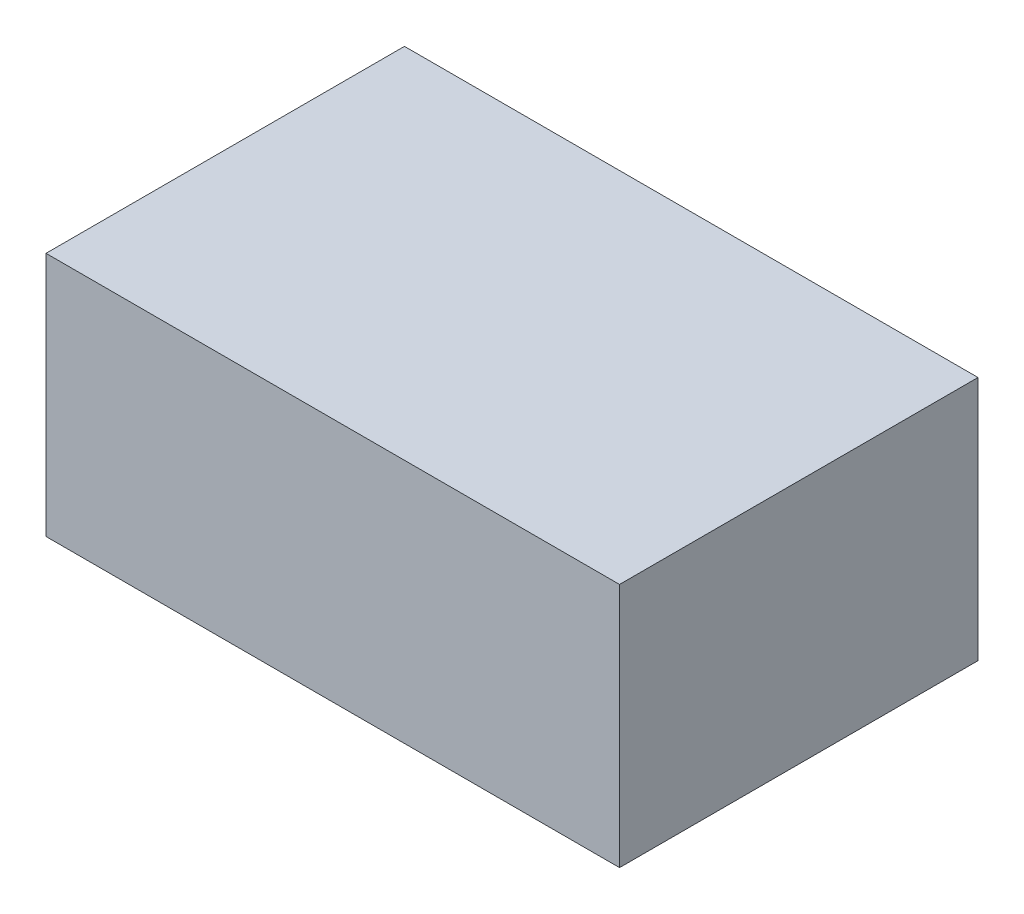
ISO-10303-21;
HEADER;
FILE_DESCRIPTION(('STEP AP214'),'2;1');
FILE_NAME('part.step','',(''),(''),'','','');
FILE_SCHEMA(('AUTOMOTIVE_DESIGN { 1 0 10303 214 1 1 1 1 }'));
ENDSEC;
DATA;
#1=APPLICATION_CONTEXT('core data for automotive mechanical design processes');
#2=APPLICATION_PROTOCOL_DEFINITION('international standard','automotive_design',2000,#1);
#3=PRODUCT_CONTEXT('',#1,'mechanical');
#4=PRODUCT('Part','Part','',(#3));
#5=PRODUCT_RELATED_PRODUCT_CATEGORY('part','',(#4));
#6=PRODUCT_DEFINITION_FORMATION('','',#4);
#7=PRODUCT_DEFINITION_CONTEXT('part definition',#1,'design');
#8=PRODUCT_DEFINITION('design','',#6,#7);
#9=PRODUCT_DEFINITION_SHAPE('','',#8);
#10=(LENGTH_UNIT() NAMED_UNIT(*) SI_UNIT(.MILLI.,.METRE.));
#11=(NAMED_UNIT(*) PLANE_ANGLE_UNIT() SI_UNIT($,.RADIAN.));
#12=(NAMED_UNIT(*) SI_UNIT($,.STERADIAN.) SOLID_ANGLE_UNIT());
#13=UNCERTAINTY_MEASURE_WITH_UNIT(LENGTH_MEASURE(1.E-05),#10,'distance_accuracy_value','');
#14=(GEOMETRIC_REPRESENTATION_CONTEXT(3) GLOBAL_UNCERTAINTY_ASSIGNED_CONTEXT((#13)) GLOBAL_UNIT_ASSIGNED_CONTEXT((#10,
#11,#12)) REPRESENTATION_CONTEXT('',''));
#15=CARTESIAN_POINT('',(0.,0.,0.));
#16=DIRECTION('',(0.,0.,1.));
#17=DIRECTION('',(1.,0.,0.));
#18=AXIS2_PLACEMENT_3D('',#15,#16,#17);
#19=CARTESIAN_POINT('',(-76.,-32.5,95.));
#20=DIRECTION('',(1.,0.,0.));
#21=DIRECTION('',(0.,0.,-1.));
#22=AXIS2_PLACEMENT_3D('',#19,#20,#21);
#23=PLANE('',#22);
#24=DIRECTION('',(0.,-1.,0.));
#25=VECTOR('',#24,1.);
#26=CARTESIAN_POINT('',(-76.,-32.5,0.));
#27=LINE('',#26,#25);
#28=CARTESIAN_POINT('',(-76.,32.5,0.));
#29=VERTEX_POINT('',#28);
#30=CARTESIAN_POINT('',(-76.,-32.5,0.));
#31=VERTEX_POINT('',#30);
#32=EDGE_CURVE('E98',#29,#31,#27,.T.);
#33=ORIENTED_EDGE('',*,*,#32,.T.);
#34=DIRECTION('',(0.,0.,-1.));
#35=VECTOR('',#34,1.);
#36=CARTESIAN_POINT('',(-76.,-32.5,95.));
#37=LINE('',#36,#35);
#38=CARTESIAN_POINT('',(-76.,-32.5,95.));
#39=VERTEX_POINT('',#38);
#40=EDGE_CURVE('E11',#39,#31,#37,.T.);
#41=ORIENTED_EDGE('',*,*,#40,.F.);
#42=DIRECTION('',(0.,-1.,0.));
#43=VECTOR('',#42,1.);
#44=CARTESIAN_POINT('',(-76.,-32.5,95.));
#45=LINE('',#44,#43);
#46=CARTESIAN_POINT('',(-76.,32.5,95.));
#47=VERTEX_POINT('',#46);
#48=EDGE_CURVE('E86',#47,#39,#45,.T.);
#49=ORIENTED_EDGE('',*,*,#48,.F.);
#50=DIRECTION('',(0.,0.,-1.));
#51=VECTOR('',#50,1.);
#52=CARTESIAN_POINT('',(-76.,32.5,95.));
#53=LINE('',#52,#51);
#54=EDGE_CURVE('E94',#47,#29,#53,.T.);
#55=ORIENTED_EDGE('',*,*,#54,.T.);
#56=EDGE_LOOP('',(#33,#41,#49,#55));
#57=FACE_BOUND('',#56,.T.);
#58=ADVANCED_FACE('F35',(#57),#23,.F.);
#59=CARTESIAN_POINT('',(76.,-32.5,95.));
#60=DIRECTION('',(0.,1.,0.));
#61=DIRECTION('',(-1.,0.,0.));
#62=AXIS2_PLACEMENT_3D('',#59,#60,#61);
#63=PLANE('',#62);
#64=DIRECTION('',(1.,0.,0.));
#65=VECTOR('',#64,1.);
#66=CARTESIAN_POINT('',(76.,-32.5,0.));
#67=LINE('',#66,#65);
#68=CARTESIAN_POINT('',(76.,-32.5,0.));
#69=VERTEX_POINT('',#68);
#70=EDGE_CURVE('E90',#31,#69,#67,.T.);
#71=ORIENTED_EDGE('',*,*,#70,.T.);
#72=DIRECTION('',(0.,0.,-1.));
#73=VECTOR('',#72,1.);
#74=CARTESIAN_POINT('',(76.,-32.5,95.));
#75=LINE('',#74,#73);
#76=CARTESIAN_POINT('',(76.,-32.5,95.));
#77=VERTEX_POINT('',#76);
#78=EDGE_CURVE('E43',#77,#69,#75,.T.);
#79=ORIENTED_EDGE('',*,*,#78,.F.);
#80=DIRECTION('',(1.,0.,0.));
#81=VECTOR('',#80,1.);
#82=CARTESIAN_POINT('',(76.,-32.5,95.));
#83=LINE('',#82,#81);
#84=EDGE_CURVE('E81',#39,#77,#83,.T.);
#85=ORIENTED_EDGE('',*,*,#84,.F.);
#86=ORIENTED_EDGE('',*,*,#40,.T.);
#87=EDGE_LOOP('',(#71,#79,#85,#86));
#88=FACE_BOUND('',#87,.T.);
#89=ADVANCED_FACE('F89',(#88),#63,.F.);
#90=CARTESIAN_POINT('',(76.,-32.5,95.));
#91=DIRECTION('',(-1.,0.,0.));
#92=DIRECTION('',(0.,0.,1.));
#93=AXIS2_PLACEMENT_3D('',#90,#91,#92);
#94=PLANE('',#93);
#95=DIRECTION('',(0.,1.,0.));
#96=VECTOR('',#95,1.);
#97=CARTESIAN_POINT('',(76.,-32.5,0.));
#98=LINE('',#97,#96);
#99=CARTESIAN_POINT('',(76.,32.5,0.));
#100=VERTEX_POINT('',#99);
#101=EDGE_CURVE('E68',#69,#100,#98,.T.);
#102=ORIENTED_EDGE('',*,*,#101,.T.);
#103=DIRECTION('',(0.,0.,-1.));
#104=VECTOR('',#103,1.);
#105=CARTESIAN_POINT('',(76.,32.5,95.));
#106=LINE('',#105,#104);
#107=CARTESIAN_POINT('',(76.,32.5,95.));
#108=VERTEX_POINT('',#107);
#109=EDGE_CURVE('E91',#108,#100,#106,.T.);
#110=ORIENTED_EDGE('',*,*,#109,.F.);
#111=DIRECTION('',(0.,1.,0.));
#112=VECTOR('',#111,1.);
#113=CARTESIAN_POINT('',(76.,-32.5,95.));
#114=LINE('',#113,#112);
#115=EDGE_CURVE('E84',#77,#108,#114,.T.);
#116=ORIENTED_EDGE('',*,*,#115,.F.);
#117=ORIENTED_EDGE('',*,*,#78,.T.);
#118=EDGE_LOOP('',(#102,#110,#116,#117));
#119=FACE_BOUND('',#118,.T.);
#120=ADVANCED_FACE('F92',(#119),#94,.F.);
#121=CARTESIAN_POINT('',(76.,32.5,95.));
#122=DIRECTION('',(0.,-1.,0.));
#123=DIRECTION('',(1.,0.,0.));
#124=AXIS2_PLACEMENT_3D('',#121,#122,#123);
#125=PLANE('',#124);
#126=DIRECTION('',(-1.,0.,0.));
#127=VECTOR('',#126,1.);
#128=CARTESIAN_POINT('',(76.,32.5,0.));
#129=LINE('',#128,#127);
#130=EDGE_CURVE('E74',#100,#29,#129,.T.);
#131=ORIENTED_EDGE('',*,*,#130,.T.);
#132=ORIENTED_EDGE('',*,*,#54,.F.);
#133=DIRECTION('',(-1.,0.,0.));
#134=VECTOR('',#133,1.);
#135=CARTESIAN_POINT('',(76.,32.5,95.));
#136=LINE('',#135,#134);
#137=EDGE_CURVE('E51',#108,#47,#136,.T.);
#138=ORIENTED_EDGE('',*,*,#137,.F.);
#139=ORIENTED_EDGE('',*,*,#109,.T.);
#140=EDGE_LOOP('',(#131,#132,#138,#139));
#141=FACE_BOUND('',#140,.T.);
#142=ADVANCED_FACE('F105',(#141),#125,.F.);
#143=CARTESIAN_POINT('',(-76.,32.5,95.));
#144=DIRECTION('',(0.,0.,1.));
#145=DIRECTION('',(1.,0.,0.));
#146=AXIS2_PLACEMENT_3D('',#143,#144,#145);
#147=PLANE('',#146);
#148=ORIENTED_EDGE('',*,*,#48,.T.);
#149=ORIENTED_EDGE('',*,*,#84,.T.);
#150=ORIENTED_EDGE('',*,*,#115,.T.);
#151=ORIENTED_EDGE('',*,*,#137,.T.);
#152=EDGE_LOOP('',(#148,#149,#150,#151));
#153=FACE_BOUND('',#152,.T.);
#154=ADVANCED_FACE('F82',(#153),#147,.T.);
#155=CARTESIAN_POINT('',(-76.,32.5,0.));
#156=DIRECTION('',(0.,0.,1.));
#157=DIRECTION('',(1.,0.,0.));
#158=AXIS2_PLACEMENT_3D('',#155,#156,#157);
#159=PLANE('',#158);
#160=ORIENTED_EDGE('',*,*,#32,.F.);
#161=ORIENTED_EDGE('',*,*,#130,.F.);
#162=ORIENTED_EDGE('',*,*,#101,.F.);
#163=ORIENTED_EDGE('',*,*,#70,.F.);
#164=EDGE_LOOP('',(#160,#161,#162,#163));
#165=FACE_BOUND('',#164,.T.);
#166=ADVANCED_FACE('F108',(#165),#159,.F.);
#167=CLOSED_SHELL('',(#58,#89,#120,#142,#154,#166));
#168=MANIFOLD_SOLID_BREP('B2',#167);
#169=ADVANCED_BREP_SHAPE_REPRESENTATION('',(#18,#168),#14);
#170=SHAPE_DEFINITION_REPRESENTATION(#9,#169);
ENDSEC;
END-ISO-10303-21;
